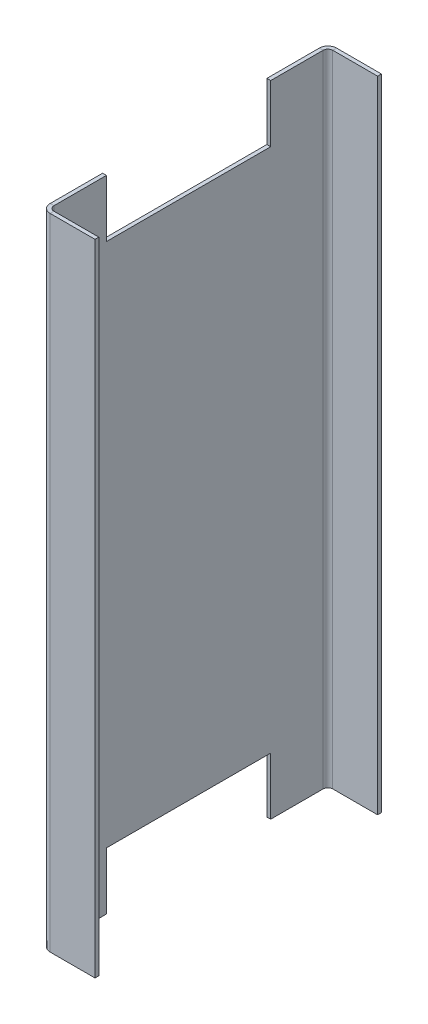
ISO-10303-21;
HEADER;
FILE_DESCRIPTION(('STEP AP214'),'2;1');
FILE_NAME('part.step','',(''),(''),'','','');
FILE_SCHEMA(('AUTOMOTIVE_DESIGN { 1 0 10303 214 1 1 1 1 }'));
ENDSEC;
DATA;
#1=APPLICATION_CONTEXT('core data for automotive mechanical design processes');
#2=APPLICATION_PROTOCOL_DEFINITION('international standard','automotive_design',2000,#1);
#3=PRODUCT_CONTEXT('',#1,'mechanical');
#4=PRODUCT('Part','Part','',(#3));
#5=PRODUCT_RELATED_PRODUCT_CATEGORY('part','',(#4));
#6=PRODUCT_DEFINITION_FORMATION('','',#4);
#7=PRODUCT_DEFINITION_CONTEXT('part definition',#1,'design');
#8=PRODUCT_DEFINITION('design','',#6,#7);
#9=PRODUCT_DEFINITION_SHAPE('','',#8);
#10=(LENGTH_UNIT() NAMED_UNIT(*) SI_UNIT(.MILLI.,.METRE.));
#11=(NAMED_UNIT(*) PLANE_ANGLE_UNIT() SI_UNIT($,.RADIAN.));
#12=(NAMED_UNIT(*) SI_UNIT($,.STERADIAN.) SOLID_ANGLE_UNIT());
#13=UNCERTAINTY_MEASURE_WITH_UNIT(LENGTH_MEASURE(1.E-05),#10,'distance_accuracy_value','');
#14=(GEOMETRIC_REPRESENTATION_CONTEXT(3) GLOBAL_UNCERTAINTY_ASSIGNED_CONTEXT((#13)) GLOBAL_UNIT_ASSIGNED_CONTEXT((#10,
#11,#12)) REPRESENTATION_CONTEXT('',''));
#15=CARTESIAN_POINT('',(0.,0.,0.));
#16=DIRECTION('',(0.,0.,1.));
#17=DIRECTION('',(1.,0.,0.));
#18=AXIS2_PLACEMENT_3D('',#15,#16,#17);
#19=CARTESIAN_POINT('',(-2.,0.,0.));
#20=DIRECTION('',(-1.,0.,0.));
#21=DIRECTION('',(0.,0.,1.));
#22=AXIS2_PLACEMENT_3D('',#19,#20,#21);
#23=PLANE('',#22);
#24=DIRECTION('',(0.,0.,1.));
#25=VECTOR('',#24,1.);
#26=CARTESIAN_POINT('',(-2.,-137.5,0.));
#27=LINE('',#26,#25);
#28=CARTESIAN_POINT('',(-2.,-137.5,-43.0000000000001));
#29=VERTEX_POINT('',#28);
#30=CARTESIAN_POINT('',(-2.,-137.5,43.0000000000001));
#31=VERTEX_POINT('',#30);
#32=EDGE_CURVE('E386',#29,#31,#27,.T.);
#33=ORIENTED_EDGE('',*,*,#32,.T.);
#34=DIRECTION('',(0.,-1.,0.));
#35=VECTOR('',#34,1.);
#36=CARTESIAN_POINT('',(-2.,0.,43.0000000000001));
#37=LINE('',#36,#35);
#38=CARTESIAN_POINT('',(-2.,-167.5,43.0000000000001));
#39=VERTEX_POINT('',#38);
#40=EDGE_CURVE('E388',#31,#39,#37,.T.);
#41=ORIENTED_EDGE('',*,*,#40,.T.);
#42=DIRECTION('',(0.,0.,-1.));
#43=VECTOR('',#42,1.);
#44=CARTESIAN_POINT('',(-2.,-167.5,75.));
#45=LINE('',#44,#43);
#46=CARTESIAN_POINT('',(-2.00000000000001,-167.5,70.5));
#47=VERTEX_POINT('',#46);
#48=EDGE_CURVE('E232',#47,#39,#45,.T.);
#49=ORIENTED_EDGE('',*,*,#48,.F.);
#50=DIRECTION('',(0.,-1.,0.));
#51=VECTOR('',#50,1.);
#52=CARTESIAN_POINT('',(-2.00000000000001,-167.5,70.5));
#53=LINE('',#52,#51);
#54=CARTESIAN_POINT('',(-2.,167.5,70.5));
#55=VERTEX_POINT('',#54);
#56=EDGE_CURVE('E335',#47,#55,#53,.F.);
#57=ORIENTED_EDGE('',*,*,#56,.T.);
#58=DIRECTION('',(0.,0.,1.));
#59=VECTOR('',#58,1.);
#60=CARTESIAN_POINT('',(-2.,167.5,75.));
#61=LINE('',#60,#59);
#62=CARTESIAN_POINT('',(-2.,167.5,43.0000000000001));
#63=VERTEX_POINT('',#62);
#64=EDGE_CURVE('E237',#63,#55,#61,.T.);
#65=ORIENTED_EDGE('',*,*,#64,.F.);
#66=DIRECTION('',(0.,1.,0.));
#67=VECTOR('',#66,1.);
#68=CARTESIAN_POINT('',(-2.,0.,43.0000000000001));
#69=LINE('',#68,#67);
#70=CARTESIAN_POINT('',(-2.,137.5,43.0000000000001));
#71=VERTEX_POINT('',#70);
#72=EDGE_CURVE('E371',#71,#63,#69,.T.);
#73=ORIENTED_EDGE('',*,*,#72,.F.);
#74=DIRECTION('',(0.,0.,1.));
#75=VECTOR('',#74,1.);
#76=CARTESIAN_POINT('',(-2.,137.5,0.));
#77=LINE('',#76,#75);
#78=CARTESIAN_POINT('',(-2.,137.5,-43.0000000000001));
#79=VERTEX_POINT('',#78);
#80=EDGE_CURVE('E344',#79,#71,#77,.T.);
#81=ORIENTED_EDGE('',*,*,#80,.F.);
#82=DIRECTION('',(0.,-1.,0.));
#83=VECTOR('',#82,1.);
#84=CARTESIAN_POINT('',(-2.,0.,-43.0000000000001));
#85=LINE('',#84,#83);
#86=CARTESIAN_POINT('',(-2.,167.5,-43.0000000000001));
#87=VERTEX_POINT('',#86);
#88=EDGE_CURVE('E373',#87,#79,#85,.T.);
#89=ORIENTED_EDGE('',*,*,#88,.F.);
#90=CARTESIAN_POINT('',(-2.00000000000001,167.5,-70.5));
#91=VERTEX_POINT('',#90);
#92=EDGE_CURVE('E240',#91,#87,#61,.T.);
#93=ORIENTED_EDGE('',*,*,#92,.F.);
#94=DIRECTION('',(0.,1.,0.));
#95=VECTOR('',#94,1.);
#96=CARTESIAN_POINT('',(-2.00000000000001,167.5,-70.5));
#97=LINE('',#96,#95);
#98=CARTESIAN_POINT('',(-2.,-167.5,-70.5));
#99=VERTEX_POINT('',#98);
#100=EDGE_CURVE('E262',#91,#99,#97,.F.);
#101=ORIENTED_EDGE('',*,*,#100,.T.);
#102=CARTESIAN_POINT('',(-2.,-167.5,-43.0000000000001));
#103=VERTEX_POINT('',#102);
#104=EDGE_CURVE('E254',#103,#99,#45,.T.);
#105=ORIENTED_EDGE('',*,*,#104,.F.);
#106=DIRECTION('',(0.,1.,0.));
#107=VECTOR('',#106,1.);
#108=CARTESIAN_POINT('',(-2.,0.,-43.0000000000001));
#109=LINE('',#108,#107);
#110=EDGE_CURVE('E92',#103,#29,#109,.T.);
#111=ORIENTED_EDGE('',*,*,#110,.T.);
#112=EDGE_LOOP('',(#33,#41,#49,#57,#65,#73,#81,#89,#93,#101,#105,#111));
#113=FACE_BOUND('',#112,.T.);
#114=ADVANCED_FACE('F77',(#113),#23,.T.);
#115=CARTESIAN_POINT('',(0.,0.,0.));
#116=DIRECTION('',(-1.,0.,0.));
#117=DIRECTION('',(0.,0.,1.));
#118=AXIS2_PLACEMENT_3D('',#115,#116,#117);
#119=PLANE('',#118);
#120=DIRECTION('',(0.,1.,0.));
#121=VECTOR('',#120,1.);
#122=CARTESIAN_POINT('',(0.,-167.5,43.0000000000001));
#123=LINE('',#122,#121);
#124=CARTESIAN_POINT('',(0.,-167.5,43.0000000000001));
#125=VERTEX_POINT('',#124);
#126=CARTESIAN_POINT('',(0.,-137.5,43.0000000000001));
#127=VERTEX_POINT('',#126);
#128=EDGE_CURVE('E214',#125,#127,#123,.T.);
#129=ORIENTED_EDGE('',*,*,#128,.T.);
#130=DIRECTION('',(0.,0.,-1.));
#131=VECTOR('',#130,1.);
#132=CARTESIAN_POINT('',(0.,-137.5,43.0000000000001));
#133=LINE('',#132,#131);
#134=CARTESIAN_POINT('',(0.,-137.5,-43.0000000000001));
#135=VERTEX_POINT('',#134);
#136=EDGE_CURVE('E393',#127,#135,#133,.T.);
#137=ORIENTED_EDGE('',*,*,#136,.T.);
#138=DIRECTION('',(0.,-1.,0.));
#139=VECTOR('',#138,1.);
#140=CARTESIAN_POINT('',(0.,-167.5,-43.0000000000001));
#141=LINE('',#140,#139);
#142=CARTESIAN_POINT('',(0.,-167.5,-43.0000000000001));
#143=VERTEX_POINT('',#142);
#144=EDGE_CURVE('E223',#135,#143,#141,.T.);
#145=ORIENTED_EDGE('',*,*,#144,.T.);
#146=DIRECTION('',(0.,0.,-1.));
#147=VECTOR('',#146,1.);
#148=CARTESIAN_POINT('',(0.,-167.5,75.));
#149=LINE('',#148,#147);
#150=CARTESIAN_POINT('',(0.,-167.5,-70.5));
#151=VERTEX_POINT('',#150);
#152=EDGE_CURVE('E238',#143,#151,#149,.T.);
#153=ORIENTED_EDGE('',*,*,#152,.T.);
#154=DIRECTION('',(0.,1.,0.));
#155=VECTOR('',#154,1.);
#156=CARTESIAN_POINT('',(0.,167.5,-70.5));
#157=LINE('',#156,#155);
#158=CARTESIAN_POINT('',(0.,167.5,-70.5));
#159=VERTEX_POINT('',#158);
#160=EDGE_CURVE('E276',#159,#151,#157,.F.);
#161=ORIENTED_EDGE('',*,*,#160,.F.);
#162=DIRECTION('',(0.,0.,1.));
#163=VECTOR('',#162,1.);
#164=CARTESIAN_POINT('',(0.,167.5,75.));
#165=LINE('',#164,#163);
#166=CARTESIAN_POINT('',(0.,167.5,-43.0000000000001));
#167=VERTEX_POINT('',#166);
#168=EDGE_CURVE('E242',#159,#167,#165,.T.);
#169=ORIENTED_EDGE('',*,*,#168,.T.);
#170=DIRECTION('',(0.,1.,0.));
#171=VECTOR('',#170,1.);
#172=CARTESIAN_POINT('',(0.,167.5,-43.0000000000001));
#173=LINE('',#172,#171);
#174=CARTESIAN_POINT('',(0.,137.5,-43.0000000000001));
#175=VERTEX_POINT('',#174);
#176=EDGE_CURVE('E100',#175,#167,#173,.T.);
#177=ORIENTED_EDGE('',*,*,#176,.F.);
#178=DIRECTION('',(0.,0.,-1.));
#179=VECTOR('',#178,1.);
#180=CARTESIAN_POINT('',(0.,137.5,43.0000000000001));
#181=LINE('',#180,#179);
#182=CARTESIAN_POINT('',(0.,137.5,43.0000000000001));
#183=VERTEX_POINT('',#182);
#184=EDGE_CURVE('E380',#183,#175,#181,.T.);
#185=ORIENTED_EDGE('',*,*,#184,.F.);
#186=DIRECTION('',(0.,-1.,0.));
#187=VECTOR('',#186,1.);
#188=CARTESIAN_POINT('',(0.,167.5,43.0000000000001));
#189=LINE('',#188,#187);
#190=CARTESIAN_POINT('',(0.,167.5,43.0000000000001));
#191=VERTEX_POINT('',#190);
#192=EDGE_CURVE('E383',#191,#183,#189,.T.);
#193=ORIENTED_EDGE('',*,*,#192,.F.);
#194=CARTESIAN_POINT('',(0.,167.5,70.5));
#195=VERTEX_POINT('',#194);
#196=EDGE_CURVE('E272',#191,#195,#165,.T.);
#197=ORIENTED_EDGE('',*,*,#196,.T.);
#198=DIRECTION('',(0.,-1.,0.));
#199=VECTOR('',#198,1.);
#200=CARTESIAN_POINT('',(0.,-167.5,70.5));
#201=LINE('',#200,#199);
#202=CARTESIAN_POINT('',(0.,-167.5,70.5));
#203=VERTEX_POINT('',#202);
#204=EDGE_CURVE('E236',#203,#195,#201,.F.);
#205=ORIENTED_EDGE('',*,*,#204,.F.);
#206=EDGE_CURVE('E230',#203,#125,#149,.T.);
#207=ORIENTED_EDGE('',*,*,#206,.T.);
#208=EDGE_LOOP('',(#129,#137,#145,#153,#161,#169,#177,#185,#193,#197,#205,#207));
#209=FACE_BOUND('',#208,.T.);
#210=ADVANCED_FACE('F234',(#209),#119,.F.);
#211=CARTESIAN_POINT('',(-2.,-167.5,75.));
#212=DIRECTION('',(0.,-1.,0.));
#213=DIRECTION('',(0.,0.,-1.));
#214=AXIS2_PLACEMENT_3D('',#211,#212,#213);
#215=PLANE('',#214);
#216=ORIENTED_EDGE('',*,*,#48,.T.);
#217=DIRECTION('',(1.,0.,0.));
#218=VECTOR('',#217,1.);
#219=CARTESIAN_POINT('',(-2.,-167.5,43.0000000000001));
#220=LINE('',#219,#218);
#221=EDGE_CURVE('E13',#39,#125,#220,.T.);
#222=ORIENTED_EDGE('',*,*,#221,.T.);
#223=ORIENTED_EDGE('',*,*,#206,.F.);
#224=DIRECTION('',(-1.,0.,0.));
#225=VECTOR('',#224,1.);
#226=CARTESIAN_POINT('',(0.,-167.5,70.5));
#227=LINE('',#226,#225);
#228=EDGE_CURVE('E319',#203,#47,#227,.T.);
#229=ORIENTED_EDGE('',*,*,#228,.T.);
#230=EDGE_LOOP('',(#216,#222,#223,#229));
#231=FACE_BOUND('',#230,.T.);
#232=ADVANCED_FACE('F228',(#231),#215,.T.);
#233=ORIENTED_EDGE('',*,*,#152,.F.);
#234=DIRECTION('',(-1.,0.,0.));
#235=VECTOR('',#234,1.);
#236=CARTESIAN_POINT('',(-2.,-167.5,-43.0000000000001));
#237=LINE('',#236,#235);
#238=EDGE_CURVE('E85',#143,#103,#237,.T.);
#239=ORIENTED_EDGE('',*,*,#238,.T.);
#240=ORIENTED_EDGE('',*,*,#104,.T.);
#241=DIRECTION('',(-1.,0.,0.));
#242=VECTOR('',#241,1.);
#243=CARTESIAN_POINT('',(0.,-167.5,-70.5));
#244=LINE('',#243,#242);
#245=EDGE_CURVE('E268',#151,#99,#244,.T.);
#246=ORIENTED_EDGE('',*,*,#245,.F.);
#247=EDGE_LOOP('',(#233,#239,#240,#246));
#248=FACE_BOUND('',#247,.T.);
#249=ADVANCED_FACE('F252',(#248),#215,.T.);
#250=CARTESIAN_POINT('',(-2.,167.5,75.));
#251=DIRECTION('',(0.,1.,0.));
#252=DIRECTION('',(0.,0.,1.));
#253=AXIS2_PLACEMENT_3D('',#250,#251,#252);
#254=PLANE('',#253);
#255=DIRECTION('',(1.,0.,0.));
#256=VECTOR('',#255,1.);
#257=CARTESIAN_POINT('',(-2.,167.5,43.0000000000001));
#258=LINE('',#257,#256);
#259=EDGE_CURVE('E248',#63,#191,#258,.T.);
#260=ORIENTED_EDGE('',*,*,#259,.F.);
#261=ORIENTED_EDGE('',*,*,#64,.T.);
#262=DIRECTION('',(-1.,0.,0.));
#263=VECTOR('',#262,1.);
#264=CARTESIAN_POINT('',(0.,167.5,70.5));
#265=LINE('',#264,#263);
#266=EDGE_CURVE('E293',#195,#55,#265,.T.);
#267=ORIENTED_EDGE('',*,*,#266,.F.);
#268=ORIENTED_EDGE('',*,*,#196,.F.);
#269=EDGE_LOOP('',(#260,#261,#267,#268));
#270=FACE_BOUND('',#269,.T.);
#271=ADVANCED_FACE('F457',(#270),#254,.T.);
#272=DIRECTION('',(-1.,0.,0.));
#273=VECTOR('',#272,1.);
#274=CARTESIAN_POINT('',(-2.,167.5,-43.0000000000001));
#275=LINE('',#274,#273);
#276=EDGE_CURVE('E246',#167,#87,#275,.T.);
#277=ORIENTED_EDGE('',*,*,#276,.F.);
#278=ORIENTED_EDGE('',*,*,#168,.F.);
#279=DIRECTION('',(-1.,0.,0.));
#280=VECTOR('',#279,1.);
#281=CARTESIAN_POINT('',(0.,167.5,-70.5));
#282=LINE('',#281,#280);
#283=EDGE_CURVE('E265',#159,#91,#282,.T.);
#284=ORIENTED_EDGE('',*,*,#283,.T.);
#285=ORIENTED_EDGE('',*,*,#92,.T.);
#286=EDGE_LOOP('',(#277,#278,#284,#285));
#287=FACE_BOUND('',#286,.T.);
#288=ADVANCED_FACE('F79',(#287),#254,.T.);
#289=CARTESIAN_POINT('',(2.5,-167.5,-70.5));
#290=DIRECTION('',(0.,-1.,0.));
#291=DIRECTION('',(0.,0.,-1.));
#292=AXIS2_PLACEMENT_3D('',#289,#290,#291);
#293=PLANE('',#292);
#294=DIRECTION('',(0.,0.,1.));
#295=VECTOR('',#294,1.);
#296=CARTESIAN_POINT('',(2.49999999999999,-167.5,-75.));
#297=LINE('',#296,#295);
#298=CARTESIAN_POINT('',(2.49999999999999,-167.5,-73.));
#299=VERTEX_POINT('',#298);
#300=CARTESIAN_POINT('',(2.49999999999998,-167.5,-75.));
#301=VERTEX_POINT('',#300);
#302=EDGE_CURVE('E289',#299,#301,#297,.F.);
#303=ORIENTED_EDGE('',*,*,#302,.F.);
#304=CARTESIAN_POINT('',(2.5,-167.5,-70.5));
#305=DIRECTION('',(0.,1.,0.));
#306=DIRECTION('',(0.,0.,1.));
#307=AXIS2_PLACEMENT_3D('',#304,#305,#306);
#308=CIRCLE('',#307,2.5);
#309=EDGE_CURVE('E280',#151,#299,#308,.F.);
#310=ORIENTED_EDGE('',*,*,#309,.F.);
#311=ORIENTED_EDGE('',*,*,#245,.T.);
#312=CARTESIAN_POINT('',(2.5,-167.5,-70.5));
#313=DIRECTION('',(0.,1.,0.));
#314=DIRECTION('',(0.,0.,1.));
#315=AXIS2_PLACEMENT_3D('',#312,#313,#314);
#316=CIRCLE('',#315,4.5);
#317=EDGE_CURVE('E269',#99,#301,#316,.F.);
#318=ORIENTED_EDGE('',*,*,#317,.T.);
#319=EDGE_LOOP('',(#303,#310,#311,#318));
#320=FACE_BOUND('',#319,.T.);
#321=ADVANCED_FACE('F465',(#320),#293,.T.);
#322=CARTESIAN_POINT('',(2.5,167.5,-70.5));
#323=DIRECTION('',(0.,-1.,0.));
#324=DIRECTION('',(0.,0.,-1.));
#325=AXIS2_PLACEMENT_3D('',#322,#323,#324);
#326=PLANE('',#325);
#327=CARTESIAN_POINT('',(2.5,167.5,-70.5));
#328=DIRECTION('',(0.,1.,0.));
#329=DIRECTION('',(0.,0.,1.));
#330=AXIS2_PLACEMENT_3D('',#327,#328,#329);
#331=CIRCLE('',#330,2.5);
#332=CARTESIAN_POINT('',(2.49999999999999,167.5,-73.));
#333=VERTEX_POINT('',#332);
#334=EDGE_CURVE('E273',#333,#159,#331,.T.);
#335=ORIENTED_EDGE('',*,*,#334,.F.);
#336=DIRECTION('',(0.,0.,1.));
#337=VECTOR('',#336,1.);
#338=CARTESIAN_POINT('',(2.5,167.5,-73.));
#339=LINE('',#338,#337);
#340=CARTESIAN_POINT('',(2.5,167.5,-75.));
#341=VERTEX_POINT('',#340);
#342=EDGE_CURVE('E295',#333,#341,#339,.F.);
#343=ORIENTED_EDGE('',*,*,#342,.T.);
#344=CARTESIAN_POINT('',(2.5,167.5,-70.5));
#345=DIRECTION('',(0.,1.,0.));
#346=DIRECTION('',(0.,0.,1.));
#347=AXIS2_PLACEMENT_3D('',#344,#345,#346);
#348=CIRCLE('',#347,4.5);
#349=EDGE_CURVE('E283',#341,#91,#348,.T.);
#350=ORIENTED_EDGE('',*,*,#349,.T.);
#351=ORIENTED_EDGE('',*,*,#283,.F.);
#352=EDGE_LOOP('',(#335,#343,#350,#351));
#353=FACE_BOUND('',#352,.T.);
#354=ADVANCED_FACE('F451',(#353),#326,.F.);
#355=CARTESIAN_POINT('',(2.5,167.5,-70.5));
#356=DIRECTION('',(0.,1.,0.));
#357=DIRECTION('',(0.,0.,-1.));
#358=AXIS2_PLACEMENT_3D('',#355,#356,#357);
#359=CYLINDRICAL_SURFACE('',#358,4.5);
#360=ORIENTED_EDGE('',*,*,#100,.F.);
#361=ORIENTED_EDGE('',*,*,#349,.F.);
#362=DIRECTION('',(0.,1.,0.));
#363=VECTOR('',#362,1.);
#364=CARTESIAN_POINT('',(2.49999999999999,-167.5,-75.));
#365=LINE('',#364,#363);
#366=EDGE_CURVE('E298',#341,#301,#365,.F.);
#367=ORIENTED_EDGE('',*,*,#366,.T.);
#368=ORIENTED_EDGE('',*,*,#317,.F.);
#369=EDGE_LOOP('',(#360,#361,#367,#368));
#370=FACE_BOUND('',#369,.T.);
#371=ADVANCED_FACE('F507',(#370),#359,.T.);
#372=CARTESIAN_POINT('',(2.5,167.5,-70.5));
#373=DIRECTION('',(0.,1.,0.));
#374=DIRECTION('',(0.,0.,-1.));
#375=AXIS2_PLACEMENT_3D('',#372,#373,#374);
#376=CYLINDRICAL_SURFACE('',#375,2.5);
#377=ORIENTED_EDGE('',*,*,#160,.T.);
#378=ORIENTED_EDGE('',*,*,#309,.T.);
#379=DIRECTION('',(0.,1.,0.));
#380=VECTOR('',#379,1.);
#381=CARTESIAN_POINT('',(2.49999999999999,-167.5,-73.));
#382=LINE('',#381,#380);
#383=EDGE_CURVE('E292',#299,#333,#382,.T.);
#384=ORIENTED_EDGE('',*,*,#383,.T.);
#385=ORIENTED_EDGE('',*,*,#334,.T.);
#386=EDGE_LOOP('',(#377,#378,#384,#385));
#387=FACE_BOUND('',#386,.T.);
#388=ADVANCED_FACE('F484',(#387),#376,.F.);
#389=CARTESIAN_POINT('',(26.,167.5,-75.0000000000001));
#390=DIRECTION('',(0.,-1.,0.));
#391=DIRECTION('',(0.,0.,-1.));
#392=AXIS2_PLACEMENT_3D('',#389,#390,#391);
#393=PLANE('',#392);
#394=ORIENTED_EDGE('',*,*,#342,.F.);
#395=DIRECTION('',(-1.,0.,0.));
#396=VECTOR('',#395,1.);
#397=CARTESIAN_POINT('',(26.,167.5,-73.0000000000001));
#398=LINE('',#397,#396);
#399=CARTESIAN_POINT('',(26.,167.5,-73.0000000000001));
#400=VERTEX_POINT('',#399);
#401=EDGE_CURVE('E300',#333,#400,#398,.F.);
#402=ORIENTED_EDGE('',*,*,#401,.T.);
#403=DIRECTION('',(0.,0.,1.));
#404=VECTOR('',#403,1.);
#405=CARTESIAN_POINT('',(26.,167.5,-75.0000000000001));
#406=LINE('',#405,#404);
#407=CARTESIAN_POINT('',(26.,167.5,-75.0000000000001));
#408=VERTEX_POINT('',#407);
#409=EDGE_CURVE('E277',#408,#400,#406,.T.);
#410=ORIENTED_EDGE('',*,*,#409,.F.);
#411=DIRECTION('',(1.,0.,0.));
#412=VECTOR('',#411,1.);
#413=CARTESIAN_POINT('',(-2.87207524181632E-13,167.5,-75.));
#414=LINE('',#413,#412);
#415=EDGE_CURVE('E307',#341,#408,#414,.T.);
#416=ORIENTED_EDGE('',*,*,#415,.F.);
#417=EDGE_LOOP('',(#394,#402,#410,#416));
#418=FACE_BOUND('',#417,.T.);
#419=ADVANCED_FACE('F502',(#418),#393,.F.);
#420=CARTESIAN_POINT('',(0.,-167.5,-75.));
#421=DIRECTION('',(0.,1.,0.));
#422=DIRECTION('',(0.,0.,1.));
#423=AXIS2_PLACEMENT_3D('',#420,#421,#422);
#424=PLANE('',#423);
#425=ORIENTED_EDGE('',*,*,#302,.T.);
#426=DIRECTION('',(-1.,0.,0.));
#427=VECTOR('',#426,1.);
#428=CARTESIAN_POINT('',(-2.87207524181632E-13,-167.5,-75.));
#429=LINE('',#428,#427);
#430=CARTESIAN_POINT('',(26.,-167.5,-75.0000000000001));
#431=VERTEX_POINT('',#430);
#432=EDGE_CURVE('E311',#431,#301,#429,.T.);
#433=ORIENTED_EDGE('',*,*,#432,.F.);
#434=DIRECTION('',(0.,0.,1.));
#435=VECTOR('',#434,1.);
#436=CARTESIAN_POINT('',(26.,-167.5,-75.0000000000001));
#437=LINE('',#436,#435);
#438=CARTESIAN_POINT('',(26.,-167.5,-73.0000000000001));
#439=VERTEX_POINT('',#438);
#440=EDGE_CURVE('E314',#431,#439,#437,.T.);
#441=ORIENTED_EDGE('',*,*,#440,.T.);
#442=DIRECTION('',(1.,0.,0.));
#443=VECTOR('',#442,1.);
#444=CARTESIAN_POINT('',(0.,-167.5,-73.));
#445=LINE('',#444,#443);
#446=EDGE_CURVE('E304',#439,#299,#445,.F.);
#447=ORIENTED_EDGE('',*,*,#446,.T.);
#448=EDGE_LOOP('',(#425,#433,#441,#447));
#449=FACE_BOUND('',#448,.T.);
#450=ADVANCED_FACE('F493',(#449),#424,.F.);
#451=CARTESIAN_POINT('',(-2.87207524181632E-13,0.,-75.));
#452=DIRECTION('',(0.,0.,1.));
#453=DIRECTION('',(1.,0.,0.));
#454=AXIS2_PLACEMENT_3D('',#451,#452,#453);
#455=PLANE('',#454);
#456=ORIENTED_EDGE('',*,*,#366,.F.);
#457=ORIENTED_EDGE('',*,*,#415,.T.);
#458=DIRECTION('',(0.,-1.,0.));
#459=VECTOR('',#458,1.);
#460=CARTESIAN_POINT('',(26.,0.,-75.0000000000001));
#461=LINE('',#460,#459);
#462=EDGE_CURVE('E309',#408,#431,#461,.T.);
#463=ORIENTED_EDGE('',*,*,#462,.T.);
#464=ORIENTED_EDGE('',*,*,#432,.T.);
#465=EDGE_LOOP('',(#456,#457,#463,#464));
#466=FACE_BOUND('',#465,.T.);
#467=ADVANCED_FACE('F505',(#466),#455,.F.);
#468=CARTESIAN_POINT('',(-2.80224561503946E-13,0.,-73.));
#469=DIRECTION('',(0.,0.,1.));
#470=DIRECTION('',(1.,0.,0.));
#471=AXIS2_PLACEMENT_3D('',#468,#469,#470);
#472=PLANE('',#471);
#473=ORIENTED_EDGE('',*,*,#401,.F.);
#474=ORIENTED_EDGE('',*,*,#383,.F.);
#475=ORIENTED_EDGE('',*,*,#446,.F.);
#476=DIRECTION('',(0.,1.,0.));
#477=VECTOR('',#476,1.);
#478=CARTESIAN_POINT('',(26.,-167.5,-73.0000000000001));
#479=LINE('',#478,#477);
#480=EDGE_CURVE('E302',#400,#439,#479,.F.);
#481=ORIENTED_EDGE('',*,*,#480,.F.);
#482=EDGE_LOOP('',(#473,#474,#475,#481));
#483=FACE_BOUND('',#482,.T.);
#484=ADVANCED_FACE('F490',(#483),#472,.T.);
#485=CARTESIAN_POINT('',(26.,-167.5,-75.0000000000001));
#486=DIRECTION('',(-1.,0.,0.));
#487=DIRECTION('',(0.,0.,1.));
#488=AXIS2_PLACEMENT_3D('',#485,#486,#487);
#489=PLANE('',#488);
#490=ORIENTED_EDGE('',*,*,#480,.T.);
#491=ORIENTED_EDGE('',*,*,#440,.F.);
#492=ORIENTED_EDGE('',*,*,#462,.F.);
#493=ORIENTED_EDGE('',*,*,#409,.T.);
#494=EDGE_LOOP('',(#490,#491,#492,#493));
#495=FACE_BOUND('',#494,.T.);
#496=ADVANCED_FACE('F498',(#495),#489,.F.);
#497=CARTESIAN_POINT('',(2.49999999999999,167.5,70.5));
#498=DIRECTION('',(0.,1.,0.));
#499=DIRECTION('',(0.,0.,1.));
#500=AXIS2_PLACEMENT_3D('',#497,#498,#499);
#501=PLANE('',#500);
#502=DIRECTION('',(0.,0.,-1.));
#503=VECTOR('',#502,1.);
#504=CARTESIAN_POINT('',(2.49999999999999,167.5,75.));
#505=LINE('',#504,#503);
#506=CARTESIAN_POINT('',(2.49999999999998,167.5,73.));
#507=VERTEX_POINT('',#506);
#508=CARTESIAN_POINT('',(2.49999999999997,167.5,75.));
#509=VERTEX_POINT('',#508);
#510=EDGE_CURVE('E340',#507,#509,#505,.F.);
#511=ORIENTED_EDGE('',*,*,#510,.F.);
#512=CARTESIAN_POINT('',(2.49999999999999,167.5,70.5));
#513=DIRECTION('',(0.,-1.,0.));
#514=DIRECTION('',(0.,0.,-1.));
#515=AXIS2_PLACEMENT_3D('',#512,#513,#514);
#516=CIRCLE('',#515,2.5);
#517=EDGE_CURVE('E329',#195,#507,#516,.F.);
#518=ORIENTED_EDGE('',*,*,#517,.F.);
#519=ORIENTED_EDGE('',*,*,#266,.T.);
#520=CARTESIAN_POINT('',(2.49999999999999,167.5,70.5));
#521=DIRECTION('',(0.,-1.,0.));
#522=DIRECTION('',(0.,0.,-1.));
#523=AXIS2_PLACEMENT_3D('',#520,#521,#522);
#524=CIRCLE('',#523,4.5);
#525=EDGE_CURVE('E321',#55,#509,#524,.F.);
#526=ORIENTED_EDGE('',*,*,#525,.T.);
#527=EDGE_LOOP('',(#511,#518,#519,#526));
#528=FACE_BOUND('',#527,.T.);
#529=ADVANCED_FACE('F428',(#528),#501,.T.);
#530=CARTESIAN_POINT('',(2.49999999999999,-167.5,70.5));
#531=DIRECTION('',(0.,1.,0.));
#532=DIRECTION('',(0.,0.,1.));
#533=AXIS2_PLACEMENT_3D('',#530,#531,#532);
#534=PLANE('',#533);
#535=CARTESIAN_POINT('',(2.49999999999999,-167.5,70.5));
#536=DIRECTION('',(0.,-1.,0.));
#537=DIRECTION('',(0.,0.,-1.));
#538=AXIS2_PLACEMENT_3D('',#535,#536,#537);
#539=CIRCLE('',#538,2.5);
#540=CARTESIAN_POINT('',(2.49999999999998,-167.5,73.));
#541=VERTEX_POINT('',#540);
#542=EDGE_CURVE('E324',#541,#203,#539,.T.);
#543=ORIENTED_EDGE('',*,*,#542,.F.);
#544=DIRECTION('',(0.,0.,-1.));
#545=VECTOR('',#544,1.);
#546=CARTESIAN_POINT('',(2.49999999999999,-167.5,73.));
#547=LINE('',#546,#545);
#548=CARTESIAN_POINT('',(2.49999999999999,-167.5,75.));
#549=VERTEX_POINT('',#548);
#550=EDGE_CURVE('E346',#541,#549,#547,.F.);
#551=ORIENTED_EDGE('',*,*,#550,.T.);
#552=CARTESIAN_POINT('',(2.49999999999999,-167.5,70.5));
#553=DIRECTION('',(0.,-1.,0.));
#554=DIRECTION('',(0.,0.,-1.));
#555=AXIS2_PLACEMENT_3D('',#552,#553,#554);
#556=CIRCLE('',#555,4.5);
#557=EDGE_CURVE('E332',#549,#47,#556,.T.);
#558=ORIENTED_EDGE('',*,*,#557,.T.);
#559=ORIENTED_EDGE('',*,*,#228,.F.);
#560=EDGE_LOOP('',(#543,#551,#558,#559));
#561=FACE_BOUND('',#560,.T.);
#562=ADVANCED_FACE('F407',(#561),#534,.F.);
#563=CARTESIAN_POINT('',(2.49999999999999,-167.5,70.5));
#564=DIRECTION('',(0.,-1.,0.));
#565=DIRECTION('',(0.,0.,1.));
#566=AXIS2_PLACEMENT_3D('',#563,#564,#565);
#567=CYLINDRICAL_SURFACE('',#566,4.5);
#568=ORIENTED_EDGE('',*,*,#56,.F.);
#569=ORIENTED_EDGE('',*,*,#557,.F.);
#570=DIRECTION('',(0.,-1.,0.));
#571=VECTOR('',#570,1.);
#572=CARTESIAN_POINT('',(2.49999999999999,167.5,75.));
#573=LINE('',#572,#571);
#574=EDGE_CURVE('E349',#549,#509,#573,.F.);
#575=ORIENTED_EDGE('',*,*,#574,.T.);
#576=ORIENTED_EDGE('',*,*,#525,.F.);
#577=EDGE_LOOP('',(#568,#569,#575,#576));
#578=FACE_BOUND('',#577,.T.);
#579=ADVANCED_FACE('F404',(#578),#567,.T.);
#580=CARTESIAN_POINT('',(2.49999999999999,-167.5,70.5));
#581=DIRECTION('',(0.,-1.,0.));
#582=DIRECTION('',(0.,0.,1.));
#583=AXIS2_PLACEMENT_3D('',#580,#581,#582);
#584=CYLINDRICAL_SURFACE('',#583,2.5);
#585=ORIENTED_EDGE('',*,*,#204,.T.);
#586=ORIENTED_EDGE('',*,*,#517,.T.);
#587=DIRECTION('',(0.,-1.,0.));
#588=VECTOR('',#587,1.);
#589=CARTESIAN_POINT('',(2.49999999999999,167.5,73.));
#590=LINE('',#589,#588);
#591=EDGE_CURVE('E343',#507,#541,#590,.T.);
#592=ORIENTED_EDGE('',*,*,#591,.T.);
#593=ORIENTED_EDGE('',*,*,#542,.T.);
#594=EDGE_LOOP('',(#585,#586,#592,#593));
#595=FACE_BOUND('',#594,.T.);
#596=ADVANCED_FACE('F432',(#595),#584,.F.);
#597=CARTESIAN_POINT('',(0.,167.5,75.));
#598=DIRECTION('',(0.,-1.,0.));
#599=DIRECTION('',(0.,0.,-1.));
#600=AXIS2_PLACEMENT_3D('',#597,#598,#599);
#601=PLANE('',#600);
#602=ORIENTED_EDGE('',*,*,#510,.T.);
#603=DIRECTION('',(-1.,0.,0.));
#604=VECTOR('',#603,1.);
#605=CARTESIAN_POINT('',(-2.87207524181632E-13,167.5,75.));
#606=LINE('',#605,#604);
#607=CARTESIAN_POINT('',(26.,167.5,75.0000000000001));
#608=VERTEX_POINT('',#607);
#609=EDGE_CURVE('E358',#608,#509,#606,.T.);
#610=ORIENTED_EDGE('',*,*,#609,.F.);
#611=DIRECTION('',(0.,0.,-1.));
#612=VECTOR('',#611,1.);
#613=CARTESIAN_POINT('',(26.,167.5,75.0000000000001));
#614=LINE('',#613,#612);
#615=CARTESIAN_POINT('',(26.,167.5,73.0000000000001));
#616=VERTEX_POINT('',#615);
#617=EDGE_CURVE('E365',#608,#616,#614,.T.);
#618=ORIENTED_EDGE('',*,*,#617,.T.);
#619=DIRECTION('',(1.,0.,0.));
#620=VECTOR('',#619,1.);
#621=CARTESIAN_POINT('',(0.,167.5,73.));
#622=LINE('',#621,#620);
#623=EDGE_CURVE('E351',#616,#507,#622,.F.);
#624=ORIENTED_EDGE('',*,*,#623,.T.);
#625=EDGE_LOOP('',(#602,#610,#618,#624));
#626=FACE_BOUND('',#625,.T.);
#627=ADVANCED_FACE('F425',(#626),#601,.F.);
#628=CARTESIAN_POINT('',(26.,-167.5,75.0000000000001));
#629=DIRECTION('',(0.,1.,0.));
#630=DIRECTION('',(0.,0.,1.));
#631=AXIS2_PLACEMENT_3D('',#628,#629,#630);
#632=PLANE('',#631);
#633=ORIENTED_EDGE('',*,*,#550,.F.);
#634=DIRECTION('',(-1.,0.,0.));
#635=VECTOR('',#634,1.);
#636=CARTESIAN_POINT('',(26.,-167.5,73.0000000000001));
#637=LINE('',#636,#635);
#638=CARTESIAN_POINT('',(26.,-167.5,73.0000000000001));
#639=VERTEX_POINT('',#638);
#640=EDGE_CURVE('E354',#541,#639,#637,.F.);
#641=ORIENTED_EDGE('',*,*,#640,.T.);
#642=DIRECTION('',(0.,0.,-1.));
#643=VECTOR('',#642,1.);
#644=CARTESIAN_POINT('',(26.,-167.5,75.0000000000001));
#645=LINE('',#644,#643);
#646=CARTESIAN_POINT('',(26.,-167.5,75.0000000000001));
#647=VERTEX_POINT('',#646);
#648=EDGE_CURVE('E327',#647,#639,#645,.T.);
#649=ORIENTED_EDGE('',*,*,#648,.F.);
#650=DIRECTION('',(1.,0.,0.));
#651=VECTOR('',#650,1.);
#652=CARTESIAN_POINT('',(-2.87207524181632E-13,-167.5,75.));
#653=LINE('',#652,#651);
#654=EDGE_CURVE('E361',#549,#647,#653,.T.);
#655=ORIENTED_EDGE('',*,*,#654,.F.);
#656=EDGE_LOOP('',(#633,#641,#649,#655));
#657=FACE_BOUND('',#656,.T.);
#658=ADVANCED_FACE('F417',(#657),#632,.F.);
#659=CARTESIAN_POINT('',(-2.87207524181632E-13,0.,75.));
#660=DIRECTION('',(0.,0.,-1.));
#661=DIRECTION('',(-1.,0.,0.));
#662=AXIS2_PLACEMENT_3D('',#659,#660,#661);
#663=PLANE('',#662);
#664=ORIENTED_EDGE('',*,*,#574,.F.);
#665=ORIENTED_EDGE('',*,*,#654,.T.);
#666=DIRECTION('',(0.,1.,0.));
#667=VECTOR('',#666,1.);
#668=CARTESIAN_POINT('',(26.,0.,75.0000000000001));
#669=LINE('',#668,#667);
#670=EDGE_CURVE('E363',#647,#608,#669,.T.);
#671=ORIENTED_EDGE('',*,*,#670,.T.);
#672=ORIENTED_EDGE('',*,*,#609,.T.);
#673=EDGE_LOOP('',(#664,#665,#671,#672));
#674=FACE_BOUND('',#673,.T.);
#675=ADVANCED_FACE('F414',(#674),#663,.F.);
#676=CARTESIAN_POINT('',(-2.80224561503946E-13,0.,73.));
#677=DIRECTION('',(0.,0.,-1.));
#678=DIRECTION('',(-1.,0.,0.));
#679=AXIS2_PLACEMENT_3D('',#676,#677,#678);
#680=PLANE('',#679);
#681=ORIENTED_EDGE('',*,*,#640,.F.);
#682=ORIENTED_EDGE('',*,*,#591,.F.);
#683=ORIENTED_EDGE('',*,*,#623,.F.);
#684=DIRECTION('',(0.,-1.,0.));
#685=VECTOR('',#684,1.);
#686=CARTESIAN_POINT('',(26.,167.5,73.0000000000001));
#687=LINE('',#686,#685);
#688=EDGE_CURVE('E356',#639,#616,#687,.F.);
#689=ORIENTED_EDGE('',*,*,#688,.F.);
#690=EDGE_LOOP('',(#681,#682,#683,#689));
#691=FACE_BOUND('',#690,.T.);
#692=ADVANCED_FACE('F434',(#691),#680,.T.);
#693=CARTESIAN_POINT('',(26.,167.5,75.0000000000001));
#694=DIRECTION('',(-1.,0.,0.));
#695=DIRECTION('',(0.,0.,1.));
#696=AXIS2_PLACEMENT_3D('',#693,#694,#695);
#697=PLANE('',#696);
#698=ORIENTED_EDGE('',*,*,#688,.T.);
#699=ORIENTED_EDGE('',*,*,#617,.F.);
#700=ORIENTED_EDGE('',*,*,#670,.F.);
#701=ORIENTED_EDGE('',*,*,#648,.T.);
#702=EDGE_LOOP('',(#698,#699,#700,#701));
#703=FACE_BOUND('',#702,.T.);
#704=ADVANCED_FACE('F422',(#703),#697,.F.);
#705=CARTESIAN_POINT('',(-10.,167.5,43.0000000000001));
#706=DIRECTION('',(0.,0.,1.));
#707=DIRECTION('',(0.,-1.,0.));
#708=AXIS2_PLACEMENT_3D('',#705,#706,#707);
#709=PLANE('',#708);
#710=ORIENTED_EDGE('',*,*,#72,.T.);
#711=ORIENTED_EDGE('',*,*,#259,.T.);
#712=ORIENTED_EDGE('',*,*,#192,.T.);
#713=DIRECTION('',(1.,0.,0.));
#714=VECTOR('',#713,1.);
#715=CARTESIAN_POINT('',(-10.,137.5,43.0000000000001));
#716=LINE('',#715,#714);
#717=EDGE_CURVE('E376',#71,#183,#716,.T.);
#718=ORIENTED_EDGE('',*,*,#717,.F.);
#719=EDGE_LOOP('',(#710,#711,#712,#718));
#720=FACE_BOUND('',#719,.T.);
#721=ADVANCED_FACE('F441',(#720),#709,.F.);
#722=CARTESIAN_POINT('',(-10.,167.5,-43.0000000000001));
#723=DIRECTION('',(0.,0.,-1.));
#724=DIRECTION('',(0.,1.,0.));
#725=AXIS2_PLACEMENT_3D('',#722,#723,#724);
#726=PLANE('',#725);
#727=ORIENTED_EDGE('',*,*,#88,.T.);
#728=DIRECTION('',(1.,0.,0.));
#729=VECTOR('',#728,1.);
#730=CARTESIAN_POINT('',(-10.,137.5,-43.0000000000001));
#731=LINE('',#730,#729);
#732=EDGE_CURVE('E375',#79,#175,#731,.T.);
#733=ORIENTED_EDGE('',*,*,#732,.T.);
#734=ORIENTED_EDGE('',*,*,#176,.T.);
#735=ORIENTED_EDGE('',*,*,#276,.T.);
#736=EDGE_LOOP('',(#727,#733,#734,#735));
#737=FACE_BOUND('',#736,.T.);
#738=ADVANCED_FACE('F581',(#737),#726,.F.);
#739=CARTESIAN_POINT('',(-10.,137.5,43.0000000000001));
#740=DIRECTION('',(0.,-1.,0.));
#741=DIRECTION('',(0.,0.,-1.));
#742=AXIS2_PLACEMENT_3D('',#739,#740,#741);
#743=PLANE('',#742);
#744=ORIENTED_EDGE('',*,*,#80,.T.);
#745=ORIENTED_EDGE('',*,*,#717,.T.);
#746=ORIENTED_EDGE('',*,*,#184,.T.);
#747=ORIENTED_EDGE('',*,*,#732,.F.);
#748=EDGE_LOOP('',(#744,#745,#746,#747));
#749=FACE_BOUND('',#748,.T.);
#750=ADVANCED_FACE('F476',(#749),#743,.F.);
#751=CARTESIAN_POINT('',(-10.,-167.5,43.0000000000001));
#752=DIRECTION('',(0.,0.,-1.));
#753=DIRECTION('',(0.,1.,0.));
#754=AXIS2_PLACEMENT_3D('',#751,#752,#753);
#755=PLANE('',#754);
#756=DIRECTION('',(1.,0.,0.));
#757=VECTOR('',#756,1.);
#758=CARTESIAN_POINT('',(-10.,-137.5,43.0000000000001));
#759=LINE('',#758,#757);
#760=EDGE_CURVE('E218',#31,#127,#759,.T.);
#761=ORIENTED_EDGE('',*,*,#760,.T.);
#762=ORIENTED_EDGE('',*,*,#128,.F.);
#763=ORIENTED_EDGE('',*,*,#221,.F.);
#764=ORIENTED_EDGE('',*,*,#40,.F.);
#765=EDGE_LOOP('',(#761,#762,#763,#764));
#766=FACE_BOUND('',#765,.T.);
#767=ADVANCED_FACE('F215',(#766),#755,.T.);
#768=CARTESIAN_POINT('',(-10.,-137.5,43.0000000000001));
#769=DIRECTION('',(0.,-1.,0.));
#770=DIRECTION('',(0.,0.,-1.));
#771=AXIS2_PLACEMENT_3D('',#768,#769,#770);
#772=PLANE('',#771);
#773=DIRECTION('',(1.,0.,0.));
#774=VECTOR('',#773,1.);
#775=CARTESIAN_POINT('',(-10.,-137.5,-43.0000000000001));
#776=LINE('',#775,#774);
#777=EDGE_CURVE('E391',#29,#135,#776,.T.);
#778=ORIENTED_EDGE('',*,*,#777,.T.);
#779=ORIENTED_EDGE('',*,*,#136,.F.);
#780=ORIENTED_EDGE('',*,*,#760,.F.);
#781=ORIENTED_EDGE('',*,*,#32,.F.);
#782=EDGE_LOOP('',(#778,#779,#780,#781));
#783=FACE_BOUND('',#782,.T.);
#784=ADVANCED_FACE('F399',(#783),#772,.T.);
#785=CARTESIAN_POINT('',(-10.,-167.5,-43.0000000000001));
#786=DIRECTION('',(0.,0.,1.));
#787=DIRECTION('',(0.,-1.,0.));
#788=AXIS2_PLACEMENT_3D('',#785,#786,#787);
#789=PLANE('',#788);
#790=ORIENTED_EDGE('',*,*,#238,.F.);
#791=ORIENTED_EDGE('',*,*,#144,.F.);
#792=ORIENTED_EDGE('',*,*,#777,.F.);
#793=ORIENTED_EDGE('',*,*,#110,.F.);
#794=EDGE_LOOP('',(#790,#791,#792,#793));
#795=FACE_BOUND('',#794,.T.);
#796=ADVANCED_FACE('F397',(#795),#789,.T.);
#797=CLOSED_SHELL('',(#114,#210,#232,#249,#271,#288,#321,#354,#371,#388,#419,#450,#467,#484,
#496,#529,#562,#579,#596,#627,#658,#675,#692,#704,#721,#738,#750,#767,#784,#796));
#798=MANIFOLD_SOLID_BREP('B2',#797);
#799=ADVANCED_BREP_SHAPE_REPRESENTATION('',(#18,#798),#14);
#800=SHAPE_DEFINITION_REPRESENTATION(#9,#799);
ENDSEC;
END-ISO-10303-21;
